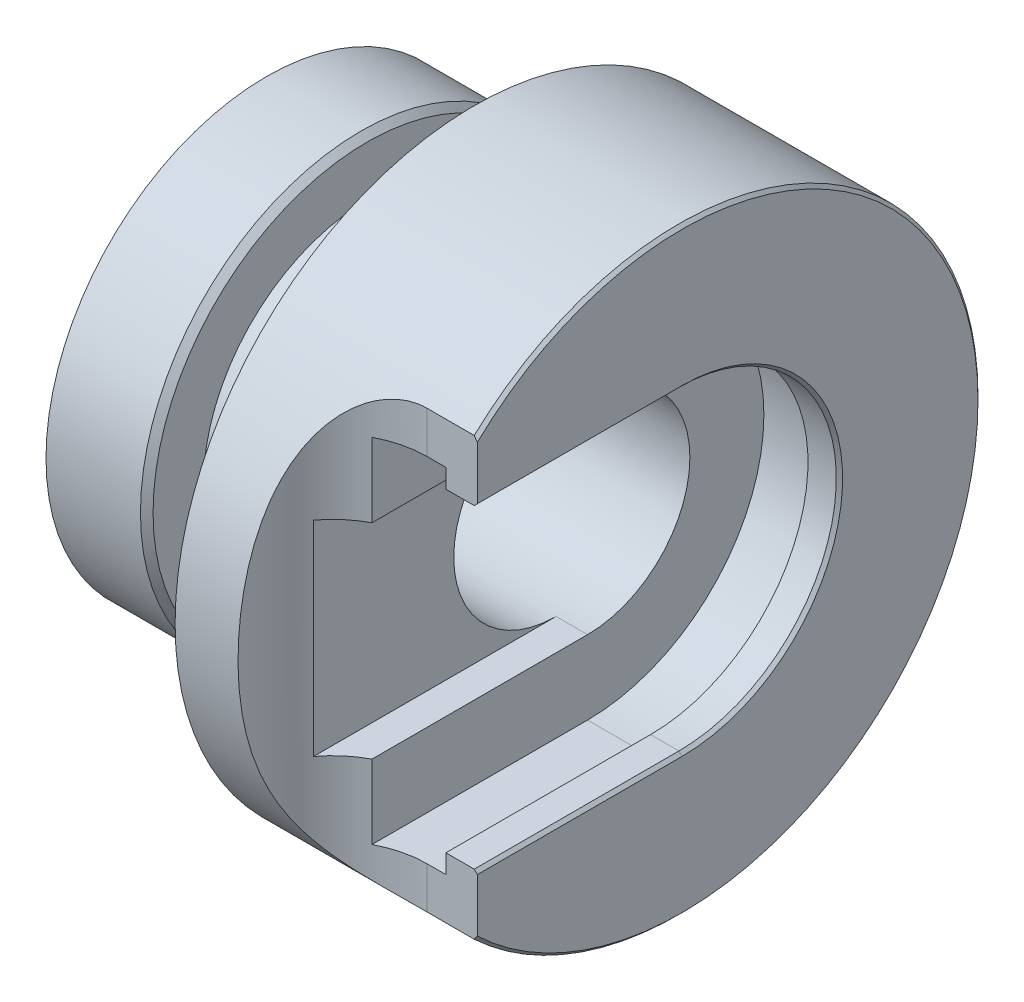
ISO-10303-21;
HEADER;
FILE_DESCRIPTION(('STEP AP214'),'2;1');
FILE_NAME('part.step','',(''),(''),'','','');
FILE_SCHEMA(('AUTOMOTIVE_DESIGN { 1 0 10303 214 1 1 1 1 }'));
ENDSEC;
DATA;
#1=APPLICATION_CONTEXT('core data for automotive mechanical design processes');
#2=APPLICATION_PROTOCOL_DEFINITION('international standard','automotive_design',2000,#1);
#3=PRODUCT_CONTEXT('',#1,'mechanical');
#4=PRODUCT('Part','Part','',(#3));
#5=PRODUCT_RELATED_PRODUCT_CATEGORY('part','',(#4));
#6=PRODUCT_DEFINITION_FORMATION('','',#4);
#7=PRODUCT_DEFINITION_CONTEXT('part definition',#1,'design');
#8=PRODUCT_DEFINITION('design','',#6,#7);
#9=PRODUCT_DEFINITION_SHAPE('','',#8);
#10=(LENGTH_UNIT() NAMED_UNIT(*) SI_UNIT(.MILLI.,.METRE.));
#11=(NAMED_UNIT(*) PLANE_ANGLE_UNIT() SI_UNIT($,.RADIAN.));
#12=(NAMED_UNIT(*) SI_UNIT($,.STERADIAN.) SOLID_ANGLE_UNIT());
#13=UNCERTAINTY_MEASURE_WITH_UNIT(LENGTH_MEASURE(1.E-05),#10,'distance_accuracy_value','');
#14=(GEOMETRIC_REPRESENTATION_CONTEXT(3) GLOBAL_UNCERTAINTY_ASSIGNED_CONTEXT((#13)) GLOBAL_UNIT_ASSIGNED_CONTEXT((#10,
#11,#12)) REPRESENTATION_CONTEXT('',''));
#15=CARTESIAN_POINT('',(0.,0.,0.));
#16=DIRECTION('',(0.,0.,1.));
#17=DIRECTION('',(1.,0.,0.));
#18=AXIS2_PLACEMENT_3D('',#15,#16,#17);
#19=CARTESIAN_POINT('',(12.2,5.6,0.));
#20=DIRECTION('',(1.,0.,0.));
#21=DIRECTION('',(0.,0.,-1.));
#22=AXIS2_PLACEMENT_3D('',#19,#20,#21);
#23=PLANE('',#22);
#24=DIRECTION('',(0.,-1.,0.));
#25=VECTOR('',#24,1.);
#26=CARTESIAN_POINT('',(12.2,5.6,6.5));
#27=LINE('',#26,#25);
#28=CARTESIAN_POINT('',(12.2,5.6,6.5));
#29=VERTEX_POINT('',#28);
#30=CARTESIAN_POINT('',(12.2,5.,6.5));
#31=VERTEX_POINT('',#30);
#32=EDGE_CURVE('E249',#29,#31,#27,.T.);
#33=ORIENTED_EDGE('',*,*,#32,.F.);
#34=DIRECTION('',(0.,0.,1.));
#35=VECTOR('',#34,1.);
#36=CARTESIAN_POINT('',(12.2,5.6,0.));
#37=LINE('',#36,#35);
#38=CARTESIAN_POINT('',(12.2,5.6,0.));
#39=VERTEX_POINT('',#38);
#40=EDGE_CURVE('E348',#39,#29,#37,.T.);
#41=ORIENTED_EDGE('',*,*,#40,.F.);
#42=CARTESIAN_POINT('',(12.2,0.,0.));
#43=DIRECTION('',(-1.,0.,0.));
#44=DIRECTION('',(0.,0.,1.));
#45=AXIS2_PLACEMENT_3D('',#42,#43,#44);
#46=CIRCLE('',#45,5.6);
#47=CARTESIAN_POINT('',(12.2,-5.6,0.));
#48=VERTEX_POINT('',#47);
#49=EDGE_CURVE('E381',#39,#48,#46,.T.);
#50=ORIENTED_EDGE('',*,*,#49,.T.);
#51=DIRECTION('',(0.,0.,1.));
#52=VECTOR('',#51,1.);
#53=CARTESIAN_POINT('',(12.2,-5.6,0.));
#54=LINE('',#53,#52);
#55=CARTESIAN_POINT('',(12.2,-5.6,6.5));
#56=VERTEX_POINT('',#55);
#57=EDGE_CURVE('E351',#48,#56,#54,.T.);
#58=ORIENTED_EDGE('',*,*,#57,.T.);
#59=CARTESIAN_POINT('',(12.2,-5.,6.5));
#60=VERTEX_POINT('',#59);
#61=EDGE_CURVE('E246',#60,#56,#27,.T.);
#62=ORIENTED_EDGE('',*,*,#61,.F.);
#63=DIRECTION('',(0.,0.,-1.));
#64=VECTOR('',#63,1.);
#65=CARTESIAN_POINT('',(12.2,-5.,0.));
#66=LINE('',#65,#64);
#67=CARTESIAN_POINT('',(12.2,-5.,0.));
#68=VERTEX_POINT('',#67);
#69=EDGE_CURVE('E365',#60,#68,#66,.T.);
#70=ORIENTED_EDGE('',*,*,#69,.T.);
#71=CARTESIAN_POINT('',(12.2,0.,0.));
#72=DIRECTION('',(-1.,0.,0.));
#73=DIRECTION('',(0.,0.,1.));
#74=AXIS2_PLACEMENT_3D('',#71,#72,#73);
#75=CIRCLE('',#74,5.);
#76=CARTESIAN_POINT('',(12.2,5.,0.));
#77=VERTEX_POINT('',#76);
#78=EDGE_CURVE('E379',#77,#68,#75,.T.);
#79=ORIENTED_EDGE('',*,*,#78,.F.);
#80=DIRECTION('',(0.,0.,1.));
#81=VECTOR('',#80,1.);
#82=CARTESIAN_POINT('',(12.2,5.,0.));
#83=LINE('',#82,#81);
#84=EDGE_CURVE('E228',#77,#31,#83,.T.);
#85=ORIENTED_EDGE('',*,*,#84,.T.);
#86=EDGE_LOOP('',(#33,#41,#50,#58,#62,#70,#79,#85));
#87=FACE_BOUND('',#86,.T.);
#88=ADVANCED_FACE('F34',(#87),#23,.F.);
#89=CARTESIAN_POINT('',(13.2,5.,0.));
#90=DIRECTION('',(-1.,0.,0.));
#91=DIRECTION('',(0.,0.,1.));
#92=AXIS2_PLACEMENT_3D('',#89,#90,#91);
#93=PLANE('',#92);
#94=DIRECTION('',(0.,1.,0.));
#95=VECTOR('',#94,1.);
#96=CARTESIAN_POINT('',(13.2,-9.5,6.5));
#97=LINE('',#96,#95);
#98=CARTESIAN_POINT('',(13.2,-6.79043444854598,6.5));
#99=VERTEX_POINT('',#98);
#100=CARTESIAN_POINT('',(13.2,-5.1,6.5));
#101=VERTEX_POINT('',#100);
#102=EDGE_CURVE('E163',#99,#101,#97,.T.);
#103=ORIENTED_EDGE('',*,*,#102,.F.);
#104=CARTESIAN_POINT('',(13.2,0.,0.));
#105=DIRECTION('',(-1.,0.,0.));
#106=DIRECTION('',(0.,0.,1.));
#107=AXIS2_PLACEMENT_3D('',#104,#105,#106);
#108=CIRCLE('',#107,9.4);
#109=CARTESIAN_POINT('',(13.2,6.79043444854598,6.5));
#110=VERTEX_POINT('',#109);
#111=EDGE_CURVE('E180',#99,#110,#108,.F.);
#112=ORIENTED_EDGE('',*,*,#111,.T.);
#113=CARTESIAN_POINT('',(13.2,5.1,6.5));
#114=VERTEX_POINT('',#113);
#115=EDGE_CURVE('E183',#114,#110,#97,.T.);
#116=ORIENTED_EDGE('',*,*,#115,.F.);
#117=DIRECTION('',(0.,0.,-1.));
#118=VECTOR('',#117,1.);
#119=CARTESIAN_POINT('',(13.2,5.1,0.));
#120=LINE('',#119,#118);
#121=CARTESIAN_POINT('',(13.2,5.1,0.));
#122=VERTEX_POINT('',#121);
#123=EDGE_CURVE('E199',#114,#122,#120,.T.);
#124=ORIENTED_EDGE('',*,*,#123,.T.);
#125=CARTESIAN_POINT('',(13.2,0.,0.));
#126=DIRECTION('',(-1.,0.,0.));
#127=DIRECTION('',(0.,0.,1.));
#128=AXIS2_PLACEMENT_3D('',#125,#126,#127);
#129=CIRCLE('',#128,5.1);
#130=CARTESIAN_POINT('',(13.2,-5.1,0.));
#131=VERTEX_POINT('',#130);
#132=EDGE_CURVE('E191',#122,#131,#129,.T.);
#133=ORIENTED_EDGE('',*,*,#132,.T.);
#134=DIRECTION('',(0.,0.,1.));
#135=VECTOR('',#134,1.);
#136=CARTESIAN_POINT('',(13.2,-5.1,0.));
#137=LINE('',#136,#135);
#138=EDGE_CURVE('E182',#131,#101,#137,.T.);
#139=ORIENTED_EDGE('',*,*,#138,.T.);
#140=EDGE_LOOP('',(#103,#112,#116,#124,#133,#139));
#141=FACE_BOUND('',#140,.T.);
#142=ADVANCED_FACE('F178',(#141),#93,.F.);
#143=CARTESIAN_POINT('',(0.,0.,0.));
#144=DIRECTION('',(-1.,0.,0.));
#145=DIRECTION('',(0.,0.,1.));
#146=AXIS2_PLACEMENT_3D('',#143,#144,#145);
#147=CYLINDRICAL_SURFACE('',#146,9.5);
#148=CARTESIAN_POINT('',(6.6,0.,0.));
#149=DIRECTION('',(-1.,0.,0.));
#150=DIRECTION('',(0.,0.,1.));
#151=AXIS2_PLACEMENT_3D('',#148,#149,#150);
#152=CIRCLE('',#151,9.5);
#153=CARTESIAN_POINT('',(6.6,0.,9.5));
#154=VERTEX_POINT('',#153);
#155=EDGE_CURVE('E376',#154,#154,#152,.T.);
#156=ORIENTED_EDGE('',*,*,#155,.F.);
#157=EDGE_LOOP('',(#156));
#158=FACE_BOUND('',#157,.T.);
#159=DIRECTION('',(-1.,0.,0.));
#160=VECTOR('',#159,1.);
#161=CARTESIAN_POINT('',(0.,6.9282032302755,6.50000000000001));
#162=LINE('',#161,#160);
#163=CARTESIAN_POINT('',(13.1,6.92820323027551,6.5));
#164=VERTEX_POINT('',#163);
#165=CARTESIAN_POINT('',(11.6,6.92820323027551,6.5));
#166=VERTEX_POINT('',#165);
#167=EDGE_CURVE('E444',#164,#166,#162,.T.);
#168=ORIENTED_EDGE('',*,*,#167,.F.);
#169=CARTESIAN_POINT('',(13.1,0.,0.));
#170=DIRECTION('',(-1.,0.,0.));
#171=DIRECTION('',(0.,0.,1.));
#172=AXIS2_PLACEMENT_3D('',#169,#170,#171);
#173=CIRCLE('',#172,9.5);
#174=CARTESIAN_POINT('',(13.1,-6.92820323027551,6.5));
#175=VERTEX_POINT('',#174);
#176=EDGE_CURVE('E188',#164,#175,#173,.T.);
#177=ORIENTED_EDGE('',*,*,#176,.T.);
#178=DIRECTION('',(-1.,0.,0.));
#179=VECTOR('',#178,1.);
#180=CARTESIAN_POINT('',(0.,-6.9282032302755,6.50000000000001));
#181=LINE('',#180,#179);
#182=CARTESIAN_POINT('',(11.6,-6.92820323027551,6.5));
#183=VERTEX_POINT('',#182);
#184=EDGE_CURVE('E167',#183,#175,#181,.F.);
#185=ORIENTED_EDGE('',*,*,#184,.F.);
#186=CARTESIAN_POINT('',(11.6,-6.92820323027551,6.5));
#187=CARTESIAN_POINT('',(11.5341252309929,-6.92820871299555,6.49998571584378));
#188=CARTESIAN_POINT('',(11.4682574340189,-6.92616776998538,6.5021693482251));
#189=CARTESIAN_POINT('',(11.3370800075273,-6.91803638050692,6.51082459844129));
#190=CARTESIAN_POINT('',(11.2717701757531,-6.91194747046755,6.51729458936117));
#191=CARTESIAN_POINT('',(11.1425403125001,-6.89580567571973,6.53437017570274));
#192=CARTESIAN_POINT('',(11.0786148058265,-6.88577364901813,6.54495400681964));
#193=CARTESIAN_POINT('',(10.9522936005245,-6.8618361309971,6.57004600623347));
#194=CARTESIAN_POINT('',(10.8898979725953,-6.84793046103339,6.58455435552005));
#195=CARTESIAN_POINT('',(10.7057980597298,-6.80058282745253,6.63356266225846));
#196=CARTESIAN_POINT('',(10.5869285618814,-6.76147846159238,6.67358054735425));
#197=CARTESIAN_POINT('',(10.3597335127723,-6.6693753755222,6.76562200151799));
#198=CARTESIAN_POINT('',(10.2514174889042,-6.61636425717357,6.81765627845118));
#199=CARTESIAN_POINT('',(10.0424933912739,-6.49534834003695,6.93308930535071));
#200=CARTESIAN_POINT('',(9.94242911922422,-6.42678948329215,6.99688535879807));
#201=CARTESIAN_POINT('',(9.75618644476116,-6.27797307172421,7.13071204585676));
#202=CARTESIAN_POINT('',(9.67001392546039,-6.19771058771366,7.20074530151359));
#203=CARTESIAN_POINT('',(9.52847584906557,-6.04582675012204,7.32841028142271));
#204=CARTESIAN_POINT('',(9.47048181827937,-5.97610521110096,7.38543846044777));
#205=CARTESIAN_POINT('',(9.3623186357523,-5.83136320820832,7.50024894470377));
#206=CARTESIAN_POINT('',(9.31215303699108,-5.75634036061837,7.55803157953091));
#207=CARTESIAN_POINT('',(9.21901387900095,-5.60161043815159,7.67341463174138));
#208=CARTESIAN_POINT('',(9.17605276352889,-5.52189557341411,7.73101456863877));
#209=CARTESIAN_POINT('',(9.09673991696468,-5.3584997165528,7.84515307115378));
#210=CARTESIAN_POINT('',(9.06039048765334,-5.27481735592478,7.90169126101722));
#211=CARTESIAN_POINT('',(8.97545512324614,-5.05759102585559,8.04335117988874));
#212=CARTESIAN_POINT('',(8.93096130422652,-4.92167440647891,8.12730071021821));
#213=CARTESIAN_POINT('',(8.85358855906614,-4.64328954339124,8.28950362841924));
#214=CARTESIAN_POINT('',(8.82071615989419,-4.50081766863467,8.36775379581803));
#215=CARTESIAN_POINT('',(8.76427104486318,-4.21032753880567,8.51762299184346));
#216=CARTESIAN_POINT('',(8.74071576839386,-4.06229944532049,8.5892293950797));
#217=CARTESIAN_POINT('',(8.70097418018759,-3.761887427709,8.72498730081263));
#218=CARTESIAN_POINT('',(8.6847900904273,-3.60950220485813,8.78913655108468));
#219=CARTESIAN_POINT('',(8.65107001277915,-3.22092796002954,8.94085514884918));
#220=CARTESIAN_POINT('',(8.63721101534871,-2.98238426141966,9.02324636126188));
#221=CARTESIAN_POINT('',(8.61742888450128,-2.49915675350021,9.16885929393321));
#222=CARTESIAN_POINT('',(8.61150947551518,-2.2544701173493,9.23207200687928));
#223=CARTESIAN_POINT('',(8.60385470103824,-1.76074931714953,9.33881954139516));
#224=CARTESIAN_POINT('',(8.60211990423702,-1.51171456682265,9.38235168771896));
#225=CARTESIAN_POINT('',(8.60023879287121,-1.01101320393396,9.44942583311252));
#226=CARTESIAN_POINT('',(8.60009220259609,-0.759347055772534,9.47297130118879));
#227=CARTESIAN_POINT('',(8.5999677553752,-0.249991665172679,9.50020080347413));
#228=CARTESIAN_POINT('',(8.59999326132484,0.00771896287933316,9.50348657887086));
#229=CARTESIAN_POINT('',(8.60001130459441,0.522589069112888,9.48911127903401));
#230=CARTESIAN_POINT('',(8.60000383760196,0.77974847080138,9.47144746411388));
#231=CARTESIAN_POINT('',(8.6010654406767,1.29183235592507,9.41528208032083));
#232=CARTESIAN_POINT('',(8.60213474295213,1.54675634532621,9.37677601758874));
#233=CARTESIAN_POINT('',(8.60773689650782,2.052561102157,9.27918586944567));
#234=CARTESIAN_POINT('',(8.61226882749389,2.3034429258218,9.2201072540586));
#235=CARTESIAN_POINT('',(8.62639188857652,2.73560040225185,9.09961996401614));
#236=CARTESIAN_POINT('',(8.63438334217029,2.91819328044235,9.04271278584244));
#237=CARTESIAN_POINT('',(8.6562953254385,3.27933847387803,8.91809454991048));
#238=CARTESIAN_POINT('',(8.67021619765103,3.45789055506171,8.85038286812547));
#239=CARTESIAN_POINT('',(8.70633825756632,3.80952838147258,8.70480503031729));
#240=CARTESIAN_POINT('',(8.72852191145465,3.98262486594695,8.62696060215921));
#241=CARTESIAN_POINT('',(8.78401282393079,4.32239724857523,8.46182542101105));
#242=CARTESIAN_POINT('',(8.81731396065263,4.48907662410991,8.37453988463023));
#243=CARTESIAN_POINT('',(8.88237353693525,4.75014628538789,8.227933757226));
#244=CARTESIAN_POINT('',(8.90956009051421,4.84711949364523,8.17116165294076));
#245=CARTESIAN_POINT('',(8.97005180415655,5.03759253132575,8.05512776240106));
#246=CARTESIAN_POINT('',(9.00335523849065,5.13109333148242,7.99586668197891));
#247=CARTESIAN_POINT('',(9.0769207908472,5.31400722574124,7.8754872100218));
#248=CARTESIAN_POINT('',(9.11717817274836,5.4034230499247,7.81437010576663));
#249=CARTESIAN_POINT('',(9.20551092454676,5.57750755049015,7.69108580949397));
#250=CARTESIAN_POINT('',(9.25358424489225,5.66217746357289,7.62891889658436));
#251=CARTESIAN_POINT('',(9.38637014890866,5.86972101037896,7.47135411314749));
#252=CARTESIAN_POINT('',(9.47695677496499,5.98891205042032,7.37589961115215));
#253=CARTESIAN_POINT('',(9.68081154097382,6.21074646421176,7.1900995707784));
#254=CARTESIAN_POINT('',(9.79404564033077,6.31341426043043,7.09974662270814));
#255=CARTESIAN_POINT('',(10.0191686299699,6.48024248994068,6.94742099221141));
#256=CARTESIAN_POINT('',(10.1269621524278,6.54800591138545,6.88335825588045));
#257=CARTESIAN_POINT('',(10.3566330466462,6.66842487180814,6.76676838671046));
#258=CARTESIAN_POINT('',(10.4785121601835,6.72107853955497,6.71424268283626));
#259=CARTESIAN_POINT('',(10.670179139717,6.78745464008674,6.64691382794452));
#260=CARTESIAN_POINT('',(10.7358351256383,6.80753623285991,6.62631930505401));
#261=CARTESIAN_POINT('',(10.8695274623169,6.84321467192588,6.58946670022242));
#262=CARTESIAN_POINT('',(10.9375625987641,6.85881376964967,6.57320644160063));
#263=CARTESIAN_POINT('',(11.0753399053703,6.8853553896326,6.54539920530944));
#264=CARTESIAN_POINT('',(11.1450787045805,6.89630642639592,6.53384361104544));
#265=CARTESIAN_POINT('',(11.2857343347783,6.91348477537384,6.51566469249243));
#266=CARTESIAN_POINT('',(11.3566502198052,6.91971570931195,6.50903758665764));
#267=CARTESIAN_POINT('',(11.4564738254032,6.92510842642277,6.50329736926519));
#268=CARTESIAN_POINT('',(11.4851746881763,6.92626963861957,6.50206046340867));
#269=CARTESIAN_POINT('',(11.5425822402144,6.927816426424,6.5004123522049));
#270=CARTESIAN_POINT('',(11.5712888694885,6.92820304533233,6.50000003621784));
#271=CARTESIAN_POINT('',(11.6,6.9282032302759,6.49999999999999));
#272=B_SPLINE_CURVE_WITH_KNOTS('',3,(#186,#187,#188,#189,#190,#191,#192,#193,#194,#195,#196,
#197,#198,#199,#200,#201,#202,#203,#204,#205,#206,#207,#208,#209,#210,#211,#212,#213,#214,#215,
#216,#217,#218,#219,#220,#221,#222,#223,#224,#225,#226,#227,#228,#229,#230,#231,#232,#233,#234,
#235,#236,#237,#238,#239,#240,#241,#242,#243,#244,#245,#246,#247,#248,#249,#250,#251,#252,#253,
#254,#255,#256,#257,#258,#259,#260,#261,#262,#263,#264,#265,#266,#267,#268,#269,#270,#271),
.UNSPECIFIED.,.F.,.F.,(4,2,2,2,2,2,2,2,2,2,2,2,2,2,2,2,2,2,2,2,2,2,2,2,2,2,2,2,2,2,2,2,2,2,2,2,
2,2,2,2,2,2,4),(0.,0.197544929972431,0.395014923417847,0.591454116338065,0.787902370121584,
1.18003952760749,1.57252747808221,1.98216976314238,2.39198507722344,2.71294154312928,
3.03404325598463,3.35569399520935,3.67745649992203,4.17415963649402,4.67114129624035,
5.16904883214555,5.66710635853884,6.42427602053031,7.18180074386835,7.93942840916635,
8.69692454920654,9.46926504350858,10.2417065519195,11.0143146751278,11.7867175266758,
12.3605989603969,12.9345135513171,13.5072171568742,14.0796059206891,14.4262378742545,
14.7727721838325,15.1190714033894,15.465279959899,15.9959603697356,16.525849047749,
16.9517684685555,17.3777406135867,17.5925239181877,17.8071991538648,18.0214794236274,
18.2355951096521,18.3218301945331,18.4079490509713),.UNSPECIFIED.);
#273=EDGE_CURVE('E209',#183,#166,#272,.T.);
#274=ORIENTED_EDGE('',*,*,#273,.T.);
#275=EDGE_LOOP('',(#168,#177,#185,#274));
#276=FACE_BOUND('',#275,.T.);
#277=ADVANCED_FACE('F296',(#158,#276),#147,.T.);
#278=CARTESIAN_POINT('',(11.7,-5.,0.));
#279=DIRECTION('',(0.,-1.,0.));
#280=DIRECTION('',(0.,0.,-1.));
#281=AXIS2_PLACEMENT_3D('',#278,#279,#280);
#282=PLANE('',#281);
#283=DIRECTION('',(-1.,0.,0.));
#284=VECTOR('',#283,1.);
#285=CARTESIAN_POINT('',(11.7,-5.,6.5));
#286=LINE('',#285,#284);
#287=CARTESIAN_POINT('',(13.1,-5.,6.5));
#288=VERTEX_POINT('',#287);
#289=EDGE_CURVE('E243',#288,#60,#286,.T.);
#290=ORIENTED_EDGE('',*,*,#289,.F.);
#291=DIRECTION('',(0.,0.,-1.));
#292=VECTOR('',#291,1.);
#293=CARTESIAN_POINT('',(13.1,-5.,0.));
#294=LINE('',#293,#292);
#295=CARTESIAN_POINT('',(13.1,-5.,0.));
#296=VERTEX_POINT('',#295);
#297=EDGE_CURVE('E57',#288,#296,#294,.T.);
#298=ORIENTED_EDGE('',*,*,#297,.T.);
#299=DIRECTION('',(1.,0.,0.));
#300=VECTOR('',#299,1.);
#301=CARTESIAN_POINT('',(11.7,-5.,0.));
#302=LINE('',#301,#300);
#303=EDGE_CURVE('E232',#68,#296,#302,.T.);
#304=ORIENTED_EDGE('',*,*,#303,.F.);
#305=ORIENTED_EDGE('',*,*,#69,.F.);
#306=EDGE_LOOP('',(#290,#298,#304,#305));
#307=FACE_BOUND('',#306,.T.);
#308=ADVANCED_FACE('F293',(#307),#282,.F.);
#309=CARTESIAN_POINT('',(11.7,5.,0.));
#310=DIRECTION('',(0.,1.,0.));
#311=DIRECTION('',(0.,0.,1.));
#312=AXIS2_PLACEMENT_3D('',#309,#310,#311);
#313=PLANE('',#312);
#314=DIRECTION('',(1.,0.,0.));
#315=VECTOR('',#314,1.);
#316=CARTESIAN_POINT('',(11.7,5.,6.5));
#317=LINE('',#316,#315);
#318=CARTESIAN_POINT('',(13.1,5.,6.5));
#319=VERTEX_POINT('',#318);
#320=EDGE_CURVE('E49',#31,#319,#317,.T.);
#321=ORIENTED_EDGE('',*,*,#320,.F.);
#322=ORIENTED_EDGE('',*,*,#84,.F.);
#323=DIRECTION('',(1.,0.,0.));
#324=VECTOR('',#323,1.);
#325=CARTESIAN_POINT('',(11.7,5.,0.));
#326=LINE('',#325,#324);
#327=CARTESIAN_POINT('',(13.1,5.,0.));
#328=VERTEX_POINT('',#327);
#329=EDGE_CURVE('E226',#77,#328,#326,.T.);
#330=ORIENTED_EDGE('',*,*,#329,.T.);
#331=DIRECTION('',(0.,0.,1.));
#332=VECTOR('',#331,1.);
#333=CARTESIAN_POINT('',(13.1,5.,0.));
#334=LINE('',#333,#332);
#335=EDGE_CURVE('E187',#328,#319,#334,.T.);
#336=ORIENTED_EDGE('',*,*,#335,.T.);
#337=EDGE_LOOP('',(#321,#322,#330,#336));
#338=FACE_BOUND('',#337,.T.);
#339=ADVANCED_FACE('F223',(#338),#313,.F.);
#340=CARTESIAN_POINT('',(12.2,5.6,0.));
#341=DIRECTION('',(0.,-1.,0.));
#342=DIRECTION('',(0.,0.,-1.));
#343=AXIS2_PLACEMENT_3D('',#340,#341,#342);
#344=PLANE('',#343);
#345=ORIENTED_EDGE('',*,*,#40,.T.);
#346=DIRECTION('',(-1.,0.,0.));
#347=VECTOR('',#346,1.);
#348=CARTESIAN_POINT('',(12.2,5.6,6.5));
#349=LINE('',#348,#347);
#350=CARTESIAN_POINT('',(11.6,5.6,6.5));
#351=VERTEX_POINT('',#350);
#352=EDGE_CURVE('E244',#29,#351,#349,.T.);
#353=ORIENTED_EDGE('',*,*,#352,.T.);
#354=CARTESIAN_POINT('',(11.6,5.6,9.5));
#355=DIRECTION('',(0.,-1.,0.));
#356=DIRECTION('',(0.,0.,-1.));
#357=AXIS2_PLACEMENT_3D('',#354,#355,#356);
#358=CIRCLE('',#357,3.);
#359=CARTESIAN_POINT('',(10.2,5.6,6.84670016771568));
#360=VERTEX_POINT('',#359);
#361=EDGE_CURVE('E328',#360,#351,#358,.T.);
#362=ORIENTED_EDGE('',*,*,#361,.F.);
#363=DIRECTION('',(0.,0.,1.));
#364=VECTOR('',#363,1.);
#365=CARTESIAN_POINT('',(10.2,5.6,0.));
#366=LINE('',#365,#364);
#367=CARTESIAN_POINT('',(10.2,5.6,0.));
#368=VERTEX_POINT('',#367);
#369=EDGE_CURVE('E347',#368,#360,#366,.T.);
#370=ORIENTED_EDGE('',*,*,#369,.F.);
#371=DIRECTION('',(-1.,0.,0.));
#372=VECTOR('',#371,1.);
#373=CARTESIAN_POINT('',(12.2,5.6,0.));
#374=LINE('',#373,#372);
#375=EDGE_CURVE('E355',#39,#368,#374,.T.);
#376=ORIENTED_EDGE('',*,*,#375,.F.);
#377=EDGE_LOOP('',(#345,#353,#362,#370,#376));
#378=FACE_BOUND('',#377,.T.);
#379=ADVANCED_FACE('F288',(#378),#344,.T.);
#380=CARTESIAN_POINT('',(12.2,-5.6,0.));
#381=DIRECTION('',(0.,-1.,0.));
#382=DIRECTION('',(0.,0.,-1.));
#383=AXIS2_PLACEMENT_3D('',#380,#381,#382);
#384=PLANE('',#383);
#385=DIRECTION('',(-1.,0.,0.));
#386=VECTOR('',#385,1.);
#387=CARTESIAN_POINT('',(12.2,-5.6,6.5));
#388=LINE('',#387,#386);
#389=CARTESIAN_POINT('',(11.6,-5.6,6.5));
#390=VERTEX_POINT('',#389);
#391=EDGE_CURVE('E172',#56,#390,#388,.T.);
#392=ORIENTED_EDGE('',*,*,#391,.F.);
#393=ORIENTED_EDGE('',*,*,#57,.F.);
#394=DIRECTION('',(-1.,0.,0.));
#395=VECTOR('',#394,1.);
#396=CARTESIAN_POINT('',(12.2,-5.6,0.));
#397=LINE('',#396,#395);
#398=CARTESIAN_POINT('',(10.2,-5.6,0.));
#399=VERTEX_POINT('',#398);
#400=EDGE_CURVE('E233',#48,#399,#397,.T.);
#401=ORIENTED_EDGE('',*,*,#400,.T.);
#402=DIRECTION('',(0.,0.,1.));
#403=VECTOR('',#402,1.);
#404=CARTESIAN_POINT('',(10.2,-5.6,0.));
#405=LINE('',#404,#403);
#406=CARTESIAN_POINT('',(10.2,-5.6,6.84670016771568));
#407=VERTEX_POINT('',#406);
#408=EDGE_CURVE('E352',#399,#407,#405,.T.);
#409=ORIENTED_EDGE('',*,*,#408,.T.);
#410=CARTESIAN_POINT('',(11.6,-5.6,9.5));
#411=DIRECTION('',(0.,-1.,0.));
#412=DIRECTION('',(0.,0.,-1.));
#413=AXIS2_PLACEMENT_3D('',#410,#411,#412);
#414=CIRCLE('',#413,3.);
#415=EDGE_CURVE('E453',#407,#390,#414,.T.);
#416=ORIENTED_EDGE('',*,*,#415,.T.);
#417=EDGE_LOOP('',(#392,#393,#401,#409,#416));
#418=FACE_BOUND('',#417,.T.);
#419=ADVANCED_FACE('F285',(#418),#384,.F.);
#420=CARTESIAN_POINT('',(13.1,0.,0.));
#421=DIRECTION('',(-1.,0.,0.));
#422=DIRECTION('',(0.,0.,1.));
#423=AXIS2_PLACEMENT_3D('',#420,#421,#422);
#424=CONICAL_SURFACE('',#423,9.5,0.785398163397448);
#425=ORIENTED_EDGE('',*,*,#176,.F.);
#426=CARTESIAN_POINT('',(1.6996421063566,19.8639109966386,6.5));
#427=CARTESIAN_POINT('',(2.02298933302925,19.5236813266195,6.5));
#428=CARTESIAN_POINT('',(2.34592544454806,19.183060015215,6.5));
#429=CARTESIAN_POINT('',(2.99081354745357,18.5008832258295,6.5));
#430=CARTESIAN_POINT('',(3.31276553275405,18.1593277420959,6.5));
#431=CARTESIAN_POINT('',(3.95567298576721,17.4749725373149,6.5));
#432=CARTESIAN_POINT('',(4.27662790411292,17.1321722999344,6.5));
#433=CARTESIAN_POINT('',(4.91717107321342,16.4452980050983,6.5));
#434=CARTESIAN_POINT('',(5.236759326538,16.10122395004,6.5));
#435=CARTESIAN_POINT('',(5.87860470037939,15.4069085359553,6.5));
#436=CARTESIAN_POINT('',(6.20083960388964,15.056646626741,6.5));
#437=CARTESIAN_POINT('',(6.84327013438432,14.3542574485225,6.5));
#438=CARTESIAN_POINT('',(7.16346576550931,14.0021301833083,6.5));
#439=CARTESIAN_POINT('',(7.80123173195866,13.295736352663,6.5));
#440=CARTESIAN_POINT('',(8.11880297867829,12.9414706108026,6.5));
#441=CARTESIAN_POINT('',(8.75081159316579,12.2301550519964,6.5));
#442=CARTESIAN_POINT('',(9.06524898549049,11.8731052569055,6.5));
#443=CARTESIAN_POINT('',(9.62875542395542,11.2260076228516,6.5));
#444=CARTESIAN_POINT('',(9.87853162640075,10.9365760980534,6.5));
#445=CARTESIAN_POINT('',(10.3749020880446,10.354998983188,6.5));
#446=CARTESIAN_POINT('',(10.6214963850222,10.0628534254158,6.5));
#447=CARTESIAN_POINT('',(11.1109647480701,9.47494022012553,6.5));
#448=CARTESIAN_POINT('',(11.3538346730934,9.17916911785229,6.5));
#449=CARTESIAN_POINT('',(11.8344934808663,8.58353612256152,6.5));
#450=CARTESIAN_POINT('',(12.0722825697453,8.28367439631232,6.5));
#451=CARTESIAN_POINT('',(12.5407601783449,7.67949599301123,6.5));
#452=CARTESIAN_POINT('',(12.7714632616544,7.37519065723161,6.5));
#453=CARTESIAN_POINT('',(13.2242115040562,6.76008817700977,6.5));
#454=CARTESIAN_POINT('',(13.446254929156,6.4492897513436,6.5));
#455=CARTESIAN_POINT('',(13.8781769861486,5.82001886733225,6.5));
#456=CARTESIAN_POINT('',(14.0880753490233,5.50156011813139,6.5));
#457=CARTESIAN_POINT('',(14.3904728008368,5.01619677562874,6.5));
#458=CARTESIAN_POINT('',(14.4891808489696,4.85315881720559,6.5));
#459=CARTESIAN_POINT('',(14.681637656578,4.52418938874678,6.5));
#460=CARTESIAN_POINT('',(14.7753869365454,4.35825822483404,6.5));
#461=CARTESIAN_POINT('',(14.9335312772322,4.06640459676012,6.5));
#462=CARTESIAN_POINT('',(14.9992591288707,3.94120557889697,6.5));
#463=CARTESIAN_POINT('',(15.1269648137317,3.6889139895751,6.5));
#464=CARTESIAN_POINT('',(15.1889426451235,3.56182141719197,6.5));
#465=CARTESIAN_POINT('',(15.3684883130222,3.17744629908155,6.5));
#466=CARTESIAN_POINT('',(15.4796508353135,2.91709807132515,6.5));
#467=CARTESIAN_POINT('',(15.6788542699589,2.3898391961148,6.5));
#468=CARTESIAN_POINT('',(15.7670645402525,2.12299348749324,6.5));
#469=CARTESIAN_POINT('',(15.9153943279027,1.5815872875099,6.5));
#470=CARTESIAN_POINT('',(15.9755364996425,1.30703320817491,6.5));
#471=CARTESIAN_POINT('',(16.0498633889698,0.832167479641046,6.5));
#472=CARTESIAN_POINT('',(16.0722803441018,0.633136095330437,6.5));
#473=CARTESIAN_POINT('',(16.0988409796656,0.233858472104878,6.5));
#474=CARTESIAN_POINT('',(16.102987932782,0.0336124572011661,6.5));
#475=CARTESIAN_POINT('',(16.0927494178031,-0.366549601837293,6.5));
#476=CARTESIAN_POINT('',(16.0783497521177,-0.566465275742164,6.5));
#477=CARTESIAN_POINT('',(16.0318446365934,-0.96422442590725,6.5));
#478=CARTESIAN_POINT('',(15.9997354660375,-1.16206745780749,6.5));
#479=CARTESIAN_POINT('',(15.9060471399467,-1.62007626691448,6.5));
#480=CARTESIAN_POINT('',(15.8382036855904,-1.87895849925934,6.5));
#481=CARTESIAN_POINT('',(15.6790151080217,-2.38935519000533,6.5));
#482=CARTESIAN_POINT('',(15.587656660033,-2.64086538073619,6.5));
#483=CARTESIAN_POINT('',(15.3859099631847,-3.13766458363497,6.5));
#484=CARTESIAN_POINT('',(15.2754191127945,-3.38291142103682,6.5));
#485=CARTESIAN_POINT('',(15.0988805814029,-3.74538342261838,6.5));
#486=CARTESIAN_POINT('',(15.0382400540789,-3.8652970187642,6.5));
#487=CARTESIAN_POINT('',(14.913774311322,-4.10345858768589,6.5));
#488=CARTESIAN_POINT('',(14.8499491790729,-4.22170660386442,6.5));
#489=CARTESIAN_POINT('',(14.6608179731557,-4.56235883850191,6.5));
#490=CARTESIAN_POINT('',(14.5318681091955,-4.78274167421387,6.5));
#491=CARTESIAN_POINT('',(14.2660382616659,-5.21869199375005,6.5));
#492=CARTESIAN_POINT('',(14.1291566569872,-5.4342584806338,6.5));
#493=CARTESIAN_POINT('',(13.8489916635442,-5.86141216237399,6.5));
#494=CARTESIAN_POINT('',(13.7057034507156,-6.07299618218063,6.5));
#495=CARTESIAN_POINT('',(13.4140699067529,-6.49261544032646,6.5));
#496=CARTESIAN_POINT('',(13.2657249207069,-6.70065091937986,6.5));
#497=CARTESIAN_POINT('',(12.9645073676952,-7.11427170756272,6.5));
#498=CARTESIAN_POINT('',(12.8116236476722,-7.31984887503981,6.5));
#499=CARTESIAN_POINT('',(12.5024402920066,-7.72842188917957,6.5));
#500=CARTESIAN_POINT('',(12.3461405500855,-7.93141765521861,6.5));
#501=CARTESIAN_POINT('',(11.8731488783289,-8.5369262475968,6.5));
#502=CARTESIAN_POINT('',(11.552232750774,-8.93613910075731,6.5));
#503=CARTESIAN_POINT('',(10.9009780112984,-9.72977688788592,6.5));
#504=CARTESIAN_POINT('',(10.5706034448976,-10.1241721256008,6.5));
#505=CARTESIAN_POINT('',(9.90390245532111,-10.9079475602421,6.5));
#506=CARTESIAN_POINT('',(9.56757552511232,-11.2973273250128,6.5));
#507=CARTESIAN_POINT('',(8.89096361643879,-12.0715778498632,6.5));
#508=CARTESIAN_POINT('',(8.55068545025919,-12.4564545766852,6.5));
#509=CARTESIAN_POINT('',(7.86668124468131,-13.2231088926667,6.5));
#510=CARTESIAN_POINT('',(7.52295529907614,-13.6048865656242,6.5));
#511=CARTESIAN_POINT('',(6.72596303770754,-14.4837581243187,6.5));
#512=CARTESIAN_POINT('',(6.27172274608338,-14.979968078031,6.5));
#513=CARTESIAN_POINT('',(5.35954802462401,-15.9693385708521,6.5));
#514=CARTESIAN_POINT('',(4.9016122059431,-16.4624978274701,6.5));
#515=CARTESIAN_POINT('',(3.987419832455,-17.4415785520273,6.5));
#516=CARTESIAN_POINT('',(3.53118908392381,-17.9275241392615,6.5));
#517=CARTESIAN_POINT('',(2.61678590784783,-18.8972047502653,6.5));
#518=CARTESIAN_POINT('',(2.15861436486921,-19.3809406078788,6.5));
#519=CARTESIAN_POINT('',(1.6996421063566,-19.8639109966386,6.5));
#520=B_SPLINE_CURVE_WITH_KNOTS('',3,(#426,#427,#428,#429,#430,#431,#432,#433,#434,#435,#436,
#437,#438,#439,#440,#441,#442,#443,#444,#445,#446,#447,#448,#449,#450,#451,#452,#453,#454,#455,
#456,#457,#458,#459,#460,#461,#462,#463,#464,#465,#466,#467,#468,#469,#470,#471,#472,#473,#474,
#475,#476,#477,#478,#479,#480,#481,#482,#483,#484,#485,#486,#487,#488,#489,#490,#491,#492,#493,
#494,#495,#496,#497,#498,#499,#500,#501,#502,#503,#504,#505,#506,#507,#508,#509,#510,#511,#512,
#513,#514,#515,#516,#517,#518,#519),.UNSPECIFIED.,.F.,.F.,(4,2,2,2,2,2,2,2,2,2,2,2,2,2,2,2,2,2,
2,2,2,2,2,2,2,2,2,2,2,2,2,2,2,2,2,2,2,2,2,2,2,2,2,2,2,2,4),(0.,1.40811532365076,
2.81623933807444,4.22503586426001,5.63382974027511,7.06164274832818,8.48945285641726,
9.91674430856962,11.3440245676791,12.4909279366079,13.6378176756929,14.785901613308,
15.9339388843924,17.0794327830361,18.2251548875657,19.368960122107,19.9406638919922,
20.5123075340362,20.9364589850766,21.3606106431856,22.2090224322719,23.0509841362067,
23.8922650939171,24.4923702384802,25.0923678825215,25.6928251028181,26.2934085255627,
27.0948338945073,27.8967143949297,28.7030364397182,29.1061239095922,29.5092008560681,
30.2749768455801,31.0409099021734,31.8074297394089,32.5738973715396,33.3424365281914,
34.1109996295844,35.6474599662407,37.1908465716275,38.7343652843262,40.2755319611044,
41.816656825212,43.8348072231267,45.8537551135499,47.8533996838244,49.8522142335209),.UNSPECIFIED.);
#521=EDGE_CURVE('E174',#164,#110,#520,.T.);
#522=ORIENTED_EDGE('',*,*,#521,.T.);
#523=ORIENTED_EDGE('',*,*,#111,.F.);
#524=EDGE_CURVE('E160',#99,#175,#520,.T.);
#525=ORIENTED_EDGE('',*,*,#524,.T.);
#526=EDGE_LOOP('',(#425,#522,#523,#525));
#527=FACE_BOUND('',#526,.T.);
#528=ADVANCED_FACE('F186',(#527),#424,.T.);
#529=CARTESIAN_POINT('',(13.1,-5.,0.));
#530=DIRECTION('',(-0.707106781186554,-0.707106781186541,0.));
#531=DIRECTION('',(0.,0.,-1.));
#532=AXIS2_PLACEMENT_3D('',#529,#530,#531);
#533=PLANE('',#532);
#534=ORIENTED_EDGE('',*,*,#297,.F.);
#535=DIRECTION('',(-0.707106781186541,0.707106781186554,0.));
#536=VECTOR('',#535,1.);
#537=CARTESIAN_POINT('',(13.1,-5.,6.5));
#538=LINE('',#537,#536);
#539=EDGE_CURVE('E242',#288,#101,#538,.F.);
#540=ORIENTED_EDGE('',*,*,#539,.T.);
#541=ORIENTED_EDGE('',*,*,#138,.F.);
#542=DIRECTION('',(0.707106781186541,-0.707106781186554,0.));
#543=VECTOR('',#542,1.);
#544=CARTESIAN_POINT('',(13.1,-5.,0.));
#545=LINE('',#544,#543);
#546=EDGE_CURVE('E208',#296,#131,#545,.T.);
#547=ORIENTED_EDGE('',*,*,#546,.F.);
#548=EDGE_LOOP('',(#534,#540,#541,#547));
#549=FACE_BOUND('',#548,.T.);
#550=ADVANCED_FACE('F241',(#549),#533,.F.);
#551=CARTESIAN_POINT('',(13.1,5.,0.));
#552=DIRECTION('',(-0.707106781186551,0.707106781186544,0.));
#553=DIRECTION('',(0.,0.,1.));
#554=AXIS2_PLACEMENT_3D('',#551,#552,#553);
#555=PLANE('',#554);
#556=ORIENTED_EDGE('',*,*,#123,.F.);
#557=DIRECTION('',(0.707106781186544,0.707106781186551,0.));
#558=VECTOR('',#557,1.);
#559=CARTESIAN_POINT('',(13.1,5.,6.5));
#560=LINE('',#559,#558);
#561=EDGE_CURVE('E42',#114,#319,#560,.F.);
#562=ORIENTED_EDGE('',*,*,#561,.T.);
#563=ORIENTED_EDGE('',*,*,#335,.F.);
#564=DIRECTION('',(0.707106781186544,0.707106781186551,0.));
#565=VECTOR('',#564,1.);
#566=CARTESIAN_POINT('',(13.1,5.,0.));
#567=LINE('',#566,#565);
#568=EDGE_CURVE('E205',#328,#122,#567,.T.);
#569=ORIENTED_EDGE('',*,*,#568,.T.);
#570=EDGE_LOOP('',(#556,#562,#563,#569));
#571=FACE_BOUND('',#570,.T.);
#572=ADVANCED_FACE('F220',(#571),#555,.F.);
#573=CARTESIAN_POINT('',(0.,0.,0.));
#574=DIRECTION('',(-1.,0.,0.));
#575=DIRECTION('',(0.,0.,1.));
#576=AXIS2_PLACEMENT_3D('',#573,#574,#575);
#577=CYLINDRICAL_SURFACE('',#576,5.6);
#578=ORIENTED_EDGE('',*,*,#375,.T.);
#579=CARTESIAN_POINT('',(10.2,0.,0.));
#580=DIRECTION('',(-1.,0.,0.));
#581=DIRECTION('',(0.,0.,1.));
#582=AXIS2_PLACEMENT_3D('',#579,#580,#581);
#583=CIRCLE('',#582,5.6);
#584=EDGE_CURVE('E384',#368,#399,#583,.T.);
#585=ORIENTED_EDGE('',*,*,#584,.T.);
#586=ORIENTED_EDGE('',*,*,#400,.F.);
#587=ORIENTED_EDGE('',*,*,#49,.F.);
#588=EDGE_LOOP('',(#578,#585,#586,#587));
#589=FACE_BOUND('',#588,.T.);
#590=ADVANCED_FACE('F405',(#589),#577,.F.);
#591=CARTESIAN_POINT('',(0.,7.,0.));
#592=DIRECTION('',(1.,0.,0.));
#593=DIRECTION('',(0.,0.,-1.));
#594=AXIS2_PLACEMENT_3D('',#591,#592,#593);
#595=PLANE('',#594);
#596=CARTESIAN_POINT('',(0.,0.,0.));
#597=DIRECTION('',(1.,0.,0.));
#598=DIRECTION('',(0.,0.,-1.));
#599=AXIS2_PLACEMENT_3D('',#596,#597,#598);
#600=CIRCLE('',#599,4.75000000000001);
#601=CARTESIAN_POINT('',(0.,0.,-4.75000000000001));
#602=VERTEX_POINT('',#601);
#603=EDGE_CURVE('E215',#602,#602,#600,.T.);
#604=ORIENTED_EDGE('',*,*,#603,.T.);
#605=EDGE_LOOP('',(#604));
#606=FACE_BOUND('',#605,.T.);
#607=CARTESIAN_POINT('',(0.,0.,0.));
#608=DIRECTION('',(-1.,0.,0.));
#609=DIRECTION('',(0.,0.,1.));
#610=AXIS2_PLACEMENT_3D('',#607,#608,#609);
#611=CIRCLE('',#610,7.);
#612=CARTESIAN_POINT('',(0.,0.,7.));
#613=VERTEX_POINT('',#612);
#614=EDGE_CURVE('E367',#613,#613,#611,.T.);
#615=ORIENTED_EDGE('',*,*,#614,.T.);
#616=EDGE_LOOP('',(#615));
#617=FACE_BOUND('',#616,.T.);
#618=ADVANCED_FACE('F402',(#606,#617),#595,.F.);
#619=CARTESIAN_POINT('',(0.,0.,0.));
#620=DIRECTION('',(-1.,0.,0.));
#621=DIRECTION('',(0.,0.,1.));
#622=AXIS2_PLACEMENT_3D('',#619,#620,#621);
#623=CYLINDRICAL_SURFACE('',#622,3.25);
#624=CARTESIAN_POINT('',(1.50000000000001,0.,0.));
#625=DIRECTION('',(1.,0.,0.));
#626=DIRECTION('',(0.,0.,-1.));
#627=AXIS2_PLACEMENT_3D('',#624,#625,#626);
#628=CIRCLE('',#627,3.25);
#629=CARTESIAN_POINT('',(1.50000000000001,0.,-3.25));
#630=VERTEX_POINT('',#629);
#631=EDGE_CURVE('E204',#630,#630,#628,.F.);
#632=ORIENTED_EDGE('',*,*,#631,.T.);
#633=EDGE_LOOP('',(#632));
#634=FACE_BOUND('',#633,.T.);
#635=CARTESIAN_POINT('',(9.2,0.,0.));
#636=DIRECTION('',(-1.,0.,0.));
#637=DIRECTION('',(0.,0.,1.));
#638=AXIS2_PLACEMENT_3D('',#635,#636,#637);
#639=CIRCLE('',#638,3.25);
#640=CARTESIAN_POINT('',(9.2,3.25,0.));
#641=VERTEX_POINT('',#640);
#642=CARTESIAN_POINT('',(9.2,-3.25,0.));
#643=VERTEX_POINT('',#642);
#644=EDGE_CURVE('E343',#641,#643,#639,.F.);
#645=ORIENTED_EDGE('',*,*,#644,.T.);
#646=DIRECTION('',(1.,0.,0.));
#647=VECTOR('',#646,1.);
#648=CARTESIAN_POINT('',(9.2,-3.25,0.));
#649=LINE('',#648,#647);
#650=CARTESIAN_POINT('',(10.2,-3.25,0.));
#651=VERTEX_POINT('',#650);
#652=EDGE_CURVE('E340',#643,#651,#649,.T.);
#653=ORIENTED_EDGE('',*,*,#652,.T.);
#654=CARTESIAN_POINT('',(10.2,0.,0.));
#655=DIRECTION('',(-1.,0.,0.));
#656=DIRECTION('',(0.,0.,1.));
#657=AXIS2_PLACEMENT_3D('',#654,#655,#656);
#658=CIRCLE('',#657,3.25);
#659=CARTESIAN_POINT('',(10.2,3.25,0.));
#660=VERTEX_POINT('',#659);
#661=EDGE_CURVE('E387',#660,#651,#658,.T.);
#662=ORIENTED_EDGE('',*,*,#661,.F.);
#663=DIRECTION('',(1.,0.,0.));
#664=VECTOR('',#663,1.);
#665=CARTESIAN_POINT('',(9.2,3.25,0.));
#666=LINE('',#665,#664);
#667=EDGE_CURVE('E336',#641,#660,#666,.T.);
#668=ORIENTED_EDGE('',*,*,#667,.F.);
#669=EDGE_LOOP('',(#645,#653,#662,#668));
#670=FACE_BOUND('',#669,.T.);
#671=ADVANCED_FACE('F404',(#634,#670),#623,.F.);
#672=CARTESIAN_POINT('',(10.2,3.25,0.));
#673=DIRECTION('',(-1.,0.,0.));
#674=DIRECTION('',(0.,0.,1.));
#675=AXIS2_PLACEMENT_3D('',#672,#673,#674);
#676=PLANE('',#675);
#677=ORIENTED_EDGE('',*,*,#369,.T.);
#678=DIRECTION('',(0.,1.,0.));
#679=VECTOR('',#678,1.);
#680=CARTESIAN_POINT('',(10.2,-9.5,6.84670016771568));
#681=LINE('',#680,#679);
#682=CARTESIAN_POINT('',(10.2,3.25,6.84670016771568));
#683=VERTEX_POINT('',#682);
#684=EDGE_CURVE('E433',#360,#683,#681,.F.);
#685=ORIENTED_EDGE('',*,*,#684,.T.);
#686=DIRECTION('',(0.,0.,1.));
#687=VECTOR('',#686,1.);
#688=CARTESIAN_POINT('',(10.2,3.25,0.));
#689=LINE('',#688,#687);
#690=EDGE_CURVE('E212',#660,#683,#689,.T.);
#691=ORIENTED_EDGE('',*,*,#690,.F.);
#692=ORIENTED_EDGE('',*,*,#661,.T.);
#693=DIRECTION('',(0.,0.,-1.));
#694=VECTOR('',#693,1.);
#695=CARTESIAN_POINT('',(10.2,-3.25,0.));
#696=LINE('',#695,#694);
#697=CARTESIAN_POINT('',(10.2,-3.25,6.84670016771568));
#698=VERTEX_POINT('',#697);
#699=EDGE_CURVE('E334',#698,#651,#696,.T.);
#700=ORIENTED_EDGE('',*,*,#699,.F.);
#701=EDGE_CURVE('E455',#698,#407,#681,.F.);
#702=ORIENTED_EDGE('',*,*,#701,.T.);
#703=ORIENTED_EDGE('',*,*,#408,.F.);
#704=ORIENTED_EDGE('',*,*,#584,.F.);
#705=EDGE_LOOP('',(#677,#685,#691,#692,#700,#702,#703,#704));
#706=FACE_BOUND('',#705,.T.);
#707=ADVANCED_FACE('F412',(#706),#676,.F.);
#708=CARTESIAN_POINT('',(0.,0.,0.));
#709=DIRECTION('',(-1.,0.,0.));
#710=DIRECTION('',(0.,0.,1.));
#711=AXIS2_PLACEMENT_3D('',#708,#709,#710);
#712=CYLINDRICAL_SURFACE('',#711,5.);
#713=ORIENTED_EDGE('',*,*,#303,.T.);
#714=CARTESIAN_POINT('',(13.1,0.,0.));
#715=DIRECTION('',(-1.,0.,0.));
#716=DIRECTION('',(0.,0.,1.));
#717=AXIS2_PLACEMENT_3D('',#714,#715,#716);
#718=CIRCLE('',#717,5.);
#719=EDGE_CURVE('E202',#296,#328,#718,.F.);
#720=ORIENTED_EDGE('',*,*,#719,.T.);
#721=ORIENTED_EDGE('',*,*,#329,.F.);
#722=ORIENTED_EDGE('',*,*,#78,.T.);
#723=EDGE_LOOP('',(#713,#720,#721,#722));
#724=FACE_BOUND('',#723,.T.);
#725=ADVANCED_FACE('F313',(#724),#712,.F.);
#726=CARTESIAN_POINT('',(6.6,9.5,0.));
#727=DIRECTION('',(1.,0.,0.));
#728=DIRECTION('',(0.,0.,-1.));
#729=AXIS2_PLACEMENT_3D('',#726,#727,#728);
#730=PLANE('',#729);
#731=CARTESIAN_POINT('',(6.6,0.,0.));
#732=DIRECTION('',(-1.,0.,0.));
#733=DIRECTION('',(0.,0.,1.));
#734=AXIS2_PLACEMENT_3D('',#731,#732,#733);
#735=CIRCLE('',#734,5.2);
#736=CARTESIAN_POINT('',(6.6,0.,5.2));
#737=VERTEX_POINT('',#736);
#738=EDGE_CURVE('E373',#737,#737,#735,.T.);
#739=ORIENTED_EDGE('',*,*,#738,.F.);
#740=EDGE_LOOP('',(#739));
#741=FACE_BOUND('',#740,.T.);
#742=ORIENTED_EDGE('',*,*,#155,.T.);
#743=EDGE_LOOP('',(#742));
#744=FACE_BOUND('',#743,.T.);
#745=ADVANCED_FACE('F309',(#741,#744),#730,.F.);
#746=CARTESIAN_POINT('',(0.,0.,0.));
#747=DIRECTION('',(-1.,0.,0.));
#748=DIRECTION('',(0.,0.,1.));
#749=AXIS2_PLACEMENT_3D('',#746,#747,#748);
#750=CYLINDRICAL_SURFACE('',#749,5.2);
#751=CARTESIAN_POINT('',(3.2,0.,0.));
#752=DIRECTION('',(-1.,0.,0.));
#753=DIRECTION('',(0.,0.,1.));
#754=AXIS2_PLACEMENT_3D('',#751,#752,#753);
#755=CIRCLE('',#754,5.2);
#756=CARTESIAN_POINT('',(3.2,0.,5.2));
#757=VERTEX_POINT('',#756);
#758=EDGE_CURVE('E370',#757,#757,#755,.T.);
#759=ORIENTED_EDGE('',*,*,#758,.F.);
#760=EDGE_LOOP('',(#759));
#761=FACE_BOUND('',#760,.T.);
#762=ORIENTED_EDGE('',*,*,#738,.T.);
#763=EDGE_LOOP('',(#762));
#764=FACE_BOUND('',#763,.T.);
#765=ADVANCED_FACE('F305',(#761,#764),#750,.T.);
#766=CARTESIAN_POINT('',(3.2,5.2,0.));
#767=DIRECTION('',(-1.,0.,0.));
#768=DIRECTION('',(0.,0.,1.));
#769=AXIS2_PLACEMENT_3D('',#766,#767,#768);
#770=PLANE('',#769);
#771=CARTESIAN_POINT('',(3.2,0.,0.));
#772=DIRECTION('',(-1.,0.,0.));
#773=DIRECTION('',(0.,0.,1.));
#774=AXIS2_PLACEMENT_3D('',#771,#772,#773);
#775=CIRCLE('',#774,6.8);
#776=CARTESIAN_POINT('',(3.2,0.,6.8));
#777=VERTEX_POINT('',#776);
#778=EDGE_CURVE('E193',#777,#777,#775,.F.);
#779=ORIENTED_EDGE('',*,*,#778,.T.);
#780=EDGE_LOOP('',(#779));
#781=FACE_BOUND('',#780,.T.);
#782=ORIENTED_EDGE('',*,*,#758,.T.);
#783=EDGE_LOOP('',(#782));
#784=FACE_BOUND('',#783,.T.);
#785=ADVANCED_FACE('F301',(#781,#784),#770,.F.);
#786=CARTESIAN_POINT('',(0.,0.,0.));
#787=DIRECTION('',(-1.,0.,0.));
#788=DIRECTION('',(0.,0.,1.));
#789=AXIS2_PLACEMENT_3D('',#786,#787,#788);
#790=CYLINDRICAL_SURFACE('',#789,7.);
#791=CARTESIAN_POINT('',(3.,0.,0.));
#792=DIRECTION('',(-1.,0.,0.));
#793=DIRECTION('',(0.,0.,1.));
#794=AXIS2_PLACEMENT_3D('',#791,#792,#793);
#795=CIRCLE('',#794,7.);
#796=CARTESIAN_POINT('',(3.,0.,7.));
#797=VERTEX_POINT('',#796);
#798=EDGE_CURVE('E390',#797,#797,#795,.T.);
#799=ORIENTED_EDGE('',*,*,#798,.T.);
#800=EDGE_LOOP('',(#799));
#801=FACE_BOUND('',#800,.T.);
#802=ORIENTED_EDGE('',*,*,#614,.F.);
#803=EDGE_LOOP('',(#802));
#804=FACE_BOUND('',#803,.T.);
#805=ADVANCED_FACE('F280',(#801,#804),#790,.T.);
#806=CARTESIAN_POINT('',(9.2,-3.25,0.));
#807=DIRECTION('',(0.,-1.,0.));
#808=DIRECTION('',(0.,0.,-1.));
#809=AXIS2_PLACEMENT_3D('',#806,#807,#808);
#810=PLANE('',#809);
#811=DIRECTION('',(0.,0.,-1.));
#812=VECTOR('',#811,1.);
#813=CARTESIAN_POINT('',(9.2,-3.25,0.));
#814=LINE('',#813,#812);
#815=CARTESIAN_POINT('',(9.2,-3.25,7.7));
#816=VERTEX_POINT('',#815);
#817=EDGE_CURVE('E333',#816,#643,#814,.T.);
#818=ORIENTED_EDGE('',*,*,#817,.F.);
#819=CARTESIAN_POINT('',(11.6,-3.25,9.5));
#820=DIRECTION('',(0.,-1.,0.));
#821=DIRECTION('',(0.,0.,-1.));
#822=AXIS2_PLACEMENT_3D('',#819,#820,#821);
#823=CIRCLE('',#822,3.);
#824=EDGE_CURVE('E458',#816,#698,#823,.T.);
#825=ORIENTED_EDGE('',*,*,#824,.T.);
#826=ORIENTED_EDGE('',*,*,#699,.T.);
#827=ORIENTED_EDGE('',*,*,#652,.F.);
#828=EDGE_LOOP('',(#818,#825,#826,#827));
#829=FACE_BOUND('',#828,.T.);
#830=ADVANCED_FACE('F277',(#829),#810,.F.);
#831=CARTESIAN_POINT('',(9.2,3.25,0.));
#832=DIRECTION('',(0.,1.,0.));
#833=DIRECTION('',(0.,0.,1.));
#834=AXIS2_PLACEMENT_3D('',#831,#832,#833);
#835=PLANE('',#834);
#836=ORIENTED_EDGE('',*,*,#690,.T.);
#837=CARTESIAN_POINT('',(11.6,3.25,9.5));
#838=DIRECTION('',(0.,1.,0.));
#839=DIRECTION('',(0.,0.,1.));
#840=AXIS2_PLACEMENT_3D('',#837,#838,#839);
#841=CIRCLE('',#840,3.);
#842=CARTESIAN_POINT('',(9.2,3.25,7.7));
#843=VERTEX_POINT('',#842);
#844=EDGE_CURVE('E461',#683,#843,#841,.T.);
#845=ORIENTED_EDGE('',*,*,#844,.T.);
#846=DIRECTION('',(0.,0.,1.));
#847=VECTOR('',#846,1.);
#848=CARTESIAN_POINT('',(9.2,3.25,0.));
#849=LINE('',#848,#847);
#850=EDGE_CURVE('E330',#641,#843,#849,.T.);
#851=ORIENTED_EDGE('',*,*,#850,.F.);
#852=ORIENTED_EDGE('',*,*,#667,.T.);
#853=EDGE_LOOP('',(#836,#845,#851,#852));
#854=FACE_BOUND('',#853,.T.);
#855=ADVANCED_FACE('F275',(#854),#835,.F.);
#856=CARTESIAN_POINT('',(9.2,0.,0.));
#857=DIRECTION('',(-1.,0.,0.));
#858=DIRECTION('',(0.,0.,1.));
#859=AXIS2_PLACEMENT_3D('',#856,#857,#858);
#860=PLANE('',#859);
#861=ORIENTED_EDGE('',*,*,#850,.T.);
#862=DIRECTION('',(0.,1.,0.));
#863=VECTOR('',#862,1.);
#864=CARTESIAN_POINT('',(9.2,-9.5,7.7));
#865=LINE('',#864,#863);
#866=EDGE_CURVE('E11',#843,#816,#865,.F.);
#867=ORIENTED_EDGE('',*,*,#866,.T.);
#868=ORIENTED_EDGE('',*,*,#817,.T.);
#869=ORIENTED_EDGE('',*,*,#644,.F.);
#870=EDGE_LOOP('',(#861,#867,#868,#869));
#871=FACE_BOUND('',#870,.T.);
#872=ADVANCED_FACE('F271',(#871),#860,.F.);
#873=CARTESIAN_POINT('',(3.,0.,0.));
#874=DIRECTION('',(-1.,0.,0.));
#875=DIRECTION('',(0.,0.,1.));
#876=AXIS2_PLACEMENT_3D('',#873,#874,#875);
#877=CONICAL_SURFACE('',#876,7.,0.785398163397455);
#878=ORIENTED_EDGE('',*,*,#778,.F.);
#879=EDGE_LOOP('',(#878));
#880=FACE_BOUND('',#879,.T.);
#881=ORIENTED_EDGE('',*,*,#798,.F.);
#882=EDGE_LOOP('',(#881));
#883=FACE_BOUND('',#882,.T.);
#884=ADVANCED_FACE('F274',(#880,#883),#877,.T.);
#885=CARTESIAN_POINT('',(13.2,0.,0.));
#886=DIRECTION('',(1.,0.,0.));
#887=DIRECTION('',(0.,0.,-1.));
#888=AXIS2_PLACEMENT_3D('',#885,#886,#887);
#889=CONICAL_SURFACE('',#888,5.1,0.785398163397453);
#890=ORIENTED_EDGE('',*,*,#546,.T.);
#891=ORIENTED_EDGE('',*,*,#132,.F.);
#892=ORIENTED_EDGE('',*,*,#568,.F.);
#893=ORIENTED_EDGE('',*,*,#719,.F.);
#894=EDGE_LOOP('',(#890,#891,#892,#893));
#895=FACE_BOUND('',#894,.T.);
#896=ADVANCED_FACE('F238',(#895),#889,.F.);
#897=CARTESIAN_POINT('',(1.50000000000001,0.,0.));
#898=DIRECTION('',(-1.,0.,0.));
#899=DIRECTION('',(0.,0.,1.));
#900=AXIS2_PLACEMENT_3D('',#897,#898,#899);
#901=CONICAL_SURFACE('',#900,3.25,0.78539816339745);
#902=ORIENTED_EDGE('',*,*,#603,.F.);
#903=EDGE_LOOP('',(#902));
#904=FACE_BOUND('',#903,.T.);
#905=ORIENTED_EDGE('',*,*,#631,.F.);
#906=EDGE_LOOP('',(#905));
#907=FACE_BOUND('',#906,.T.);
#908=ADVANCED_FACE('F36',(#904,#907),#901,.F.);
#909=CARTESIAN_POINT('',(11.6,-9.5,9.5));
#910=DIRECTION('',(0.,1.,0.));
#911=DIRECTION('',(0.,0.,1.));
#912=AXIS2_PLACEMENT_3D('',#909,#910,#911);
#913=CYLINDRICAL_SURFACE('',#912,3.);
#914=DIRECTION('',(0.,1.,0.));
#915=VECTOR('',#914,1.);
#916=CARTESIAN_POINT('',(11.6,-9.5,6.5));
#917=LINE('',#916,#915);
#918=EDGE_CURVE('E446',#183,#390,#917,.T.);
#919=ORIENTED_EDGE('',*,*,#918,.T.);
#920=ORIENTED_EDGE('',*,*,#415,.F.);
#921=ORIENTED_EDGE('',*,*,#701,.F.);
#922=ORIENTED_EDGE('',*,*,#824,.F.);
#923=ORIENTED_EDGE('',*,*,#866,.F.);
#924=ORIENTED_EDGE('',*,*,#844,.F.);
#925=ORIENTED_EDGE('',*,*,#684,.F.);
#926=ORIENTED_EDGE('',*,*,#361,.T.);
#927=EDGE_CURVE('E442',#351,#166,#917,.T.);
#928=ORIENTED_EDGE('',*,*,#927,.T.);
#929=ORIENTED_EDGE('',*,*,#273,.F.);
#930=EDGE_LOOP('',(#919,#920,#921,#922,#923,#924,#925,#926,#928,#929));
#931=FACE_BOUND('',#930,.T.);
#932=ADVANCED_FACE('F269',(#931),#913,.F.);
#933=CARTESIAN_POINT('',(11.6,-9.5,6.5));
#934=DIRECTION('',(0.,0.,1.));
#935=DIRECTION('',(1.,0.,0.));
#936=AXIS2_PLACEMENT_3D('',#933,#934,#935);
#937=PLANE('',#936);
#938=ORIENTED_EDGE('',*,*,#167,.T.);
#939=ORIENTED_EDGE('',*,*,#927,.F.);
#940=ORIENTED_EDGE('',*,*,#352,.F.);
#941=ORIENTED_EDGE('',*,*,#32,.T.);
#942=ORIENTED_EDGE('',*,*,#320,.T.);
#943=ORIENTED_EDGE('',*,*,#561,.F.);
#944=ORIENTED_EDGE('',*,*,#115,.T.);
#945=ORIENTED_EDGE('',*,*,#521,.F.);
#946=EDGE_LOOP('',(#938,#939,#940,#941,#942,#943,#944,#945));
#947=FACE_BOUND('',#946,.T.);
#948=ADVANCED_FACE('F264',(#947),#937,.T.);
#949=ORIENTED_EDGE('',*,*,#184,.T.);
#950=ORIENTED_EDGE('',*,*,#524,.F.);
#951=ORIENTED_EDGE('',*,*,#102,.T.);
#952=ORIENTED_EDGE('',*,*,#539,.F.);
#953=ORIENTED_EDGE('',*,*,#289,.T.);
#954=ORIENTED_EDGE('',*,*,#61,.T.);
#955=ORIENTED_EDGE('',*,*,#391,.T.);
#956=ORIENTED_EDGE('',*,*,#918,.F.);
#957=EDGE_LOOP('',(#949,#950,#951,#952,#953,#954,#955,#956));
#958=FACE_BOUND('',#957,.T.);
#959=ADVANCED_FACE('F162',(#958),#937,.T.);
#960=CLOSED_SHELL('',(#88,#142,#277,#308,#339,#379,#419,#528,#550,#572,#590,#618,#671,#707,#725,
#745,#765,#785,#805,#830,#855,#872,#884,#896,#908,#932,#948,#959));
#961=MANIFOLD_SOLID_BREP('B2',#960);
#962=ADVANCED_BREP_SHAPE_REPRESENTATION('',(#18,#961),#14);
#963=SHAPE_DEFINITION_REPRESENTATION(#9,#962);
ENDSEC;
END-ISO-10303-21;
